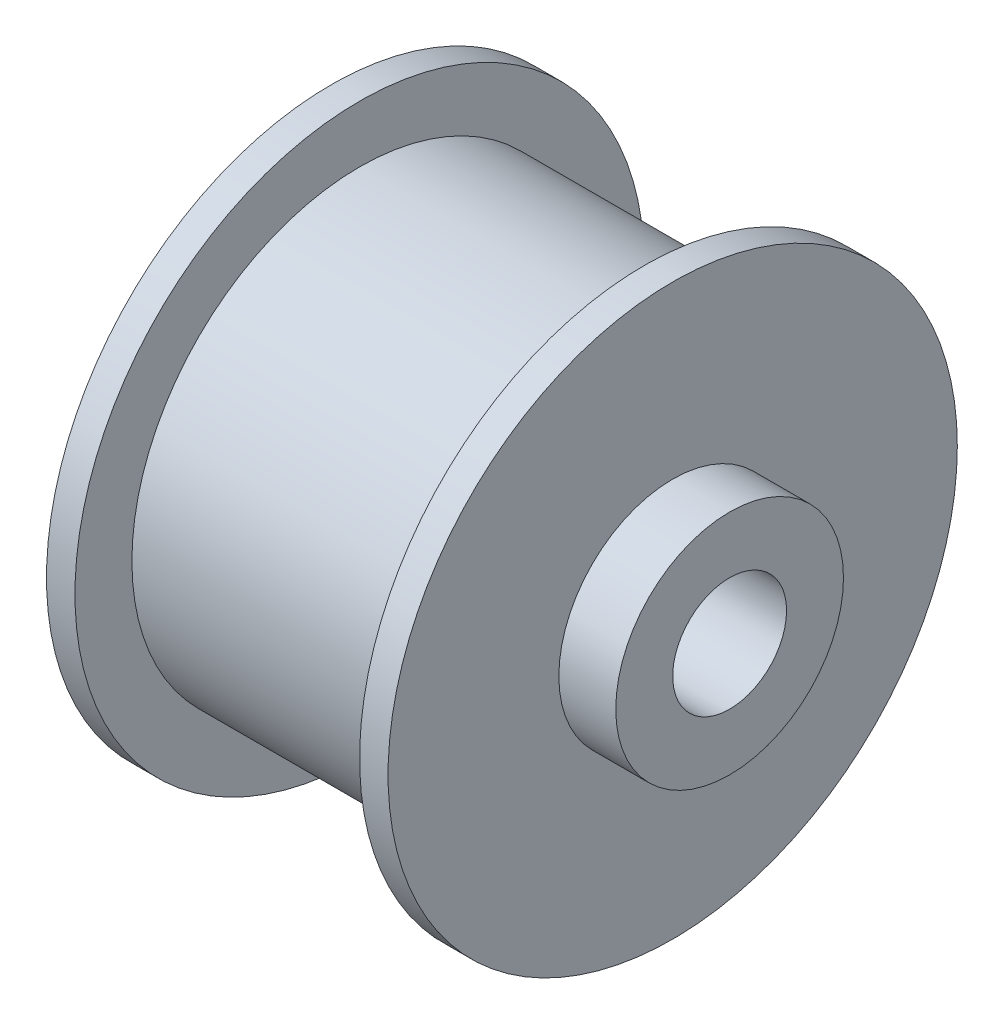
ISO-10303-21;
HEADER;
FILE_DESCRIPTION(('STEP AP214'),'2;1');
FILE_NAME('part.step','',(''),(''),'','','');
FILE_SCHEMA(('AUTOMOTIVE_DESIGN { 1 0 10303 214 1 1 1 1 }'));
ENDSEC;
DATA;
#1=APPLICATION_CONTEXT('core data for automotive mechanical design processes');
#2=APPLICATION_PROTOCOL_DEFINITION('international standard','automotive_design',2000,#1);
#3=PRODUCT_CONTEXT('',#1,'mechanical');
#4=PRODUCT('Part','Part','',(#3));
#5=PRODUCT_RELATED_PRODUCT_CATEGORY('part','',(#4));
#6=PRODUCT_DEFINITION_FORMATION('','',#4);
#7=PRODUCT_DEFINITION_CONTEXT('part definition',#1,'design');
#8=PRODUCT_DEFINITION('design','',#6,#7);
#9=PRODUCT_DEFINITION_SHAPE('','',#8);
#10=(LENGTH_UNIT() NAMED_UNIT(*) SI_UNIT(.MILLI.,.METRE.));
#11=(NAMED_UNIT(*) PLANE_ANGLE_UNIT() SI_UNIT($,.RADIAN.));
#12=(NAMED_UNIT(*) SI_UNIT($,.STERADIAN.) SOLID_ANGLE_UNIT());
#13=UNCERTAINTY_MEASURE_WITH_UNIT(LENGTH_MEASURE(1.E-05),#10,'distance_accuracy_value','');
#14=(GEOMETRIC_REPRESENTATION_CONTEXT(3) GLOBAL_UNCERTAINTY_ASSIGNED_CONTEXT((#13)) GLOBAL_UNIT_ASSIGNED_CONTEXT((#10,
#11,#12)) REPRESENTATION_CONTEXT('',''));
#15=CARTESIAN_POINT('',(0.,0.,0.));
#16=DIRECTION('',(0.,0.,1.));
#17=DIRECTION('',(1.,0.,0.));
#18=AXIS2_PLACEMENT_3D('',#15,#16,#17);
#19=CARTESIAN_POINT('',(0.,0.,0.));
#20=DIRECTION('',(1.,0.,0.));
#21=DIRECTION('',(0.,0.,-1.));
#22=AXIS2_PLACEMENT_3D('',#19,#20,#21);
#23=CYLINDRICAL_SURFACE('',#22,25.);
#24=CARTESIAN_POINT('',(-2.5,0.,0.));
#25=DIRECTION('',(1.,0.,0.));
#26=DIRECTION('',(0.,0.,-1.));
#27=AXIS2_PLACEMENT_3D('',#24,#25,#26);
#28=CIRCLE('',#27,25.);
#29=CARTESIAN_POINT('',(-2.5,0.,-25.));
#30=VERTEX_POINT('',#29);
#31=EDGE_CURVE('E50',#30,#30,#28,.T.);
#32=ORIENTED_EDGE('',*,*,#31,.T.);
#33=EDGE_LOOP('',(#32));
#34=FACE_BOUND('',#33,.T.);
#35=CARTESIAN_POINT('',(0.,0.,0.));
#36=DIRECTION('',(1.,0.,0.));
#37=DIRECTION('',(0.,0.,-1.));
#38=AXIS2_PLACEMENT_3D('',#35,#36,#37);
#39=CIRCLE('',#38,25.);
#40=CARTESIAN_POINT('',(0.,0.,-25.));
#41=VERTEX_POINT('',#40);
#42=EDGE_CURVE('E101',#41,#41,#39,.T.);
#43=ORIENTED_EDGE('',*,*,#42,.F.);
#44=EDGE_LOOP('',(#43));
#45=FACE_BOUND('',#44,.T.);
#46=ADVANCED_FACE('F37',(#34,#45),#23,.T.);
#47=CARTESIAN_POINT('',(-2.5,25.,0.));
#48=DIRECTION('',(-1.,0.,0.));
#49=DIRECTION('',(0.,0.,1.));
#50=AXIS2_PLACEMENT_3D('',#47,#48,#49);
#51=PLANE('',#50);
#52=CARTESIAN_POINT('',(-2.5,0.,0.));
#53=DIRECTION('',(1.,0.,0.));
#54=DIRECTION('',(0.,0.,-1.));
#55=AXIS2_PLACEMENT_3D('',#52,#53,#54);
#56=CIRCLE('',#55,20.);
#57=CARTESIAN_POINT('',(-2.5,0.,-20.));
#58=VERTEX_POINT('',#57);
#59=EDGE_CURVE('E55',#58,#58,#56,.T.);
#60=ORIENTED_EDGE('',*,*,#59,.T.);
#61=EDGE_LOOP('',(#60));
#62=FACE_BOUND('',#61,.T.);
#63=ORIENTED_EDGE('',*,*,#31,.F.);
#64=EDGE_LOOP('',(#63));
#65=FACE_BOUND('',#64,.T.);
#66=ADVANCED_FACE('F110',(#62,#65),#51,.T.);
#67=CARTESIAN_POINT('',(0.,0.,0.));
#68=DIRECTION('',(1.,0.,0.));
#69=DIRECTION('',(0.,0.,-1.));
#70=AXIS2_PLACEMENT_3D('',#67,#68,#69);
#71=CYLINDRICAL_SURFACE('',#70,20.);
#72=CARTESIAN_POINT('',(-27.5,0.,0.));
#73=DIRECTION('',(1.,0.,0.));
#74=DIRECTION('',(0.,0.,-1.));
#75=AXIS2_PLACEMENT_3D('',#72,#73,#74);
#76=CIRCLE('',#75,20.);
#77=CARTESIAN_POINT('',(-27.5,0.,-20.));
#78=VERTEX_POINT('',#77);
#79=EDGE_CURVE('E61',#78,#78,#76,.T.);
#80=ORIENTED_EDGE('',*,*,#79,.T.);
#81=EDGE_LOOP('',(#80));
#82=FACE_BOUND('',#81,.T.);
#83=ORIENTED_EDGE('',*,*,#59,.F.);
#84=EDGE_LOOP('',(#83));
#85=FACE_BOUND('',#84,.T.);
#86=ADVANCED_FACE('F115',(#82,#85),#71,.T.);
#87=CARTESIAN_POINT('',(-27.5,20.,0.));
#88=DIRECTION('',(1.,0.,0.));
#89=DIRECTION('',(0.,0.,-1.));
#90=AXIS2_PLACEMENT_3D('',#87,#88,#89);
#91=PLANE('',#90);
#92=CARTESIAN_POINT('',(-27.5,0.,0.));
#93=DIRECTION('',(1.,0.,0.));
#94=DIRECTION('',(0.,0.,-1.));
#95=AXIS2_PLACEMENT_3D('',#92,#93,#94);
#96=CIRCLE('',#95,25.);
#97=CARTESIAN_POINT('',(-27.5,0.,-25.));
#98=VERTEX_POINT('',#97);
#99=EDGE_CURVE('E65',#98,#98,#96,.T.);
#100=ORIENTED_EDGE('',*,*,#99,.T.);
#101=EDGE_LOOP('',(#100));
#102=FACE_BOUND('',#101,.T.);
#103=ORIENTED_EDGE('',*,*,#79,.F.);
#104=EDGE_LOOP('',(#103));
#105=FACE_BOUND('',#104,.T.);
#106=ADVANCED_FACE('F121',(#102,#105),#91,.T.);
#107=CARTESIAN_POINT('',(0.,0.,0.));
#108=DIRECTION('',(1.,0.,0.));
#109=DIRECTION('',(0.,0.,-1.));
#110=AXIS2_PLACEMENT_3D('',#107,#108,#109);
#111=CYLINDRICAL_SURFACE('',#110,25.);
#112=CARTESIAN_POINT('',(-30.,0.,0.));
#113=DIRECTION('',(1.,0.,0.));
#114=DIRECTION('',(0.,0.,-1.));
#115=AXIS2_PLACEMENT_3D('',#112,#113,#114);
#116=CIRCLE('',#115,25.);
#117=CARTESIAN_POINT('',(-30.,0.,-25.));
#118=VERTEX_POINT('',#117);
#119=EDGE_CURVE('E69',#118,#118,#116,.T.);
#120=ORIENTED_EDGE('',*,*,#119,.T.);
#121=EDGE_LOOP('',(#120));
#122=FACE_BOUND('',#121,.T.);
#123=ORIENTED_EDGE('',*,*,#99,.F.);
#124=EDGE_LOOP('',(#123));
#125=FACE_BOUND('',#124,.T.);
#126=ADVANCED_FACE('F125',(#122,#125),#111,.T.);
#127=CARTESIAN_POINT('',(-30.,25.,0.));
#128=DIRECTION('',(-1.,0.,0.));
#129=DIRECTION('',(0.,0.,1.));
#130=AXIS2_PLACEMENT_3D('',#127,#128,#129);
#131=PLANE('',#130);
#132=CARTESIAN_POINT('',(-30.,0.,0.));
#133=DIRECTION('',(1.,0.,0.));
#134=DIRECTION('',(0.,0.,-1.));
#135=AXIS2_PLACEMENT_3D('',#132,#133,#134);
#136=CIRCLE('',#135,17.5);
#137=CARTESIAN_POINT('',(-30.,0.,-17.5));
#138=VERTEX_POINT('',#137);
#139=EDGE_CURVE('E73',#138,#138,#136,.T.);
#140=ORIENTED_EDGE('',*,*,#139,.T.);
#141=EDGE_LOOP('',(#140));
#142=FACE_BOUND('',#141,.T.);
#143=ORIENTED_EDGE('',*,*,#119,.F.);
#144=EDGE_LOOP('',(#143));
#145=FACE_BOUND('',#144,.T.);
#146=ADVANCED_FACE('F129',(#142,#145),#131,.T.);
#147=CARTESIAN_POINT('',(0.,0.,0.));
#148=DIRECTION('',(1.,0.,0.));
#149=DIRECTION('',(0.,0.,-1.));
#150=AXIS2_PLACEMENT_3D('',#147,#148,#149);
#151=CYLINDRICAL_SURFACE('',#150,17.5);
#152=CARTESIAN_POINT('',(-25.,0.,0.));
#153=DIRECTION('',(1.,0.,0.));
#154=DIRECTION('',(0.,0.,-1.));
#155=AXIS2_PLACEMENT_3D('',#152,#153,#154);
#156=CIRCLE('',#155,17.5);
#157=CARTESIAN_POINT('',(-25.,0.,-17.5));
#158=VERTEX_POINT('',#157);
#159=EDGE_CURVE('E77',#158,#158,#156,.T.);
#160=ORIENTED_EDGE('',*,*,#159,.T.);
#161=EDGE_LOOP('',(#160));
#162=FACE_BOUND('',#161,.T.);
#163=ORIENTED_EDGE('',*,*,#139,.F.);
#164=EDGE_LOOP('',(#163));
#165=FACE_BOUND('',#164,.T.);
#166=ADVANCED_FACE('F133',(#162,#165),#151,.F.);
#167=CARTESIAN_POINT('',(-25.,7.5,0.));
#168=DIRECTION('',(-1.,0.,0.));
#169=DIRECTION('',(0.,0.,1.));
#170=AXIS2_PLACEMENT_3D('',#167,#168,#169);
#171=PLANE('',#170);
#172=CARTESIAN_POINT('',(-25.,0.,0.));
#173=DIRECTION('',(1.,0.,0.));
#174=DIRECTION('',(0.,0.,-1.));
#175=AXIS2_PLACEMENT_3D('',#172,#173,#174);
#176=CIRCLE('',#175,7.5);
#177=CARTESIAN_POINT('',(-25.,0.,-7.5));
#178=VERTEX_POINT('',#177);
#179=EDGE_CURVE('E81',#178,#178,#176,.T.);
#180=ORIENTED_EDGE('',*,*,#179,.T.);
#181=EDGE_LOOP('',(#180));
#182=FACE_BOUND('',#181,.T.);
#183=ORIENTED_EDGE('',*,*,#159,.F.);
#184=EDGE_LOOP('',(#183));
#185=FACE_BOUND('',#184,.T.);
#186=ADVANCED_FACE('F137',(#182,#185),#171,.T.);
#187=CARTESIAN_POINT('',(0.,0.,0.));
#188=DIRECTION('',(1.,0.,0.));
#189=DIRECTION('',(0.,0.,-1.));
#190=AXIS2_PLACEMENT_3D('',#187,#188,#189);
#191=CYLINDRICAL_SURFACE('',#190,7.5);
#192=CARTESIAN_POINT('',(-29.,0.,0.));
#193=DIRECTION('',(-1.,0.,0.));
#194=DIRECTION('',(0.,0.,1.));
#195=AXIS2_PLACEMENT_3D('',#192,#193,#194);
#196=CIRCLE('',#195,7.5);
#197=CARTESIAN_POINT('',(-29.,0.,7.5));
#198=VERTEX_POINT('',#197);
#199=EDGE_CURVE('E45',#198,#198,#196,.F.);
#200=ORIENTED_EDGE('',*,*,#199,.T.);
#201=EDGE_LOOP('',(#200));
#202=FACE_BOUND('',#201,.T.);
#203=ORIENTED_EDGE('',*,*,#179,.F.);
#204=EDGE_LOOP('',(#203));
#205=FACE_BOUND('',#204,.T.);
#206=ADVANCED_FACE('F141',(#202,#205),#191,.T.);
#207=CARTESIAN_POINT('',(-30.,7.5,0.));
#208=DIRECTION('',(-1.,0.,0.));
#209=DIRECTION('',(0.,0.,1.));
#210=AXIS2_PLACEMENT_3D('',#207,#208,#209);
#211=PLANE('',#210);
#212=CARTESIAN_POINT('',(-30.,0.,0.));
#213=DIRECTION('',(-1.,0.,0.));
#214=DIRECTION('',(0.,0.,1.));
#215=AXIS2_PLACEMENT_3D('',#212,#213,#214);
#216=CIRCLE('',#215,6.5);
#217=CARTESIAN_POINT('',(-30.,0.,6.5));
#218=VERTEX_POINT('',#217);
#219=EDGE_CURVE('E10',#218,#218,#216,.T.);
#220=ORIENTED_EDGE('',*,*,#219,.T.);
#221=EDGE_LOOP('',(#220));
#222=FACE_BOUND('',#221,.T.);
#223=CARTESIAN_POINT('',(-30.,0.,0.));
#224=DIRECTION('',(1.,0.,0.));
#225=DIRECTION('',(0.,0.,-1.));
#226=AXIS2_PLACEMENT_3D('',#223,#224,#225);
#227=CIRCLE('',#226,5.);
#228=CARTESIAN_POINT('',(-30.,0.,-5.));
#229=VERTEX_POINT('',#228);
#230=EDGE_CURVE('E85',#229,#229,#227,.T.);
#231=ORIENTED_EDGE('',*,*,#230,.T.);
#232=EDGE_LOOP('',(#231));
#233=FACE_BOUND('',#232,.T.);
#234=ADVANCED_FACE('F145',(#222,#233),#211,.T.);
#235=CARTESIAN_POINT('',(0.,0.,0.));
#236=DIRECTION('',(1.,0.,0.));
#237=DIRECTION('',(0.,0.,-1.));
#238=AXIS2_PLACEMENT_3D('',#235,#236,#237);
#239=CYLINDRICAL_SURFACE('',#238,5.);
#240=CARTESIAN_POINT('',(5.,0.,0.));
#241=DIRECTION('',(1.,0.,0.));
#242=DIRECTION('',(0.,0.,-1.));
#243=AXIS2_PLACEMENT_3D('',#240,#241,#242);
#244=CIRCLE('',#243,5.);
#245=CARTESIAN_POINT('',(5.,0.,-5.));
#246=VERTEX_POINT('',#245);
#247=EDGE_CURVE('E89',#246,#246,#244,.T.);
#248=ORIENTED_EDGE('',*,*,#247,.T.);
#249=EDGE_LOOP('',(#248));
#250=FACE_BOUND('',#249,.T.);
#251=ORIENTED_EDGE('',*,*,#230,.F.);
#252=EDGE_LOOP('',(#251));
#253=FACE_BOUND('',#252,.T.);
#254=ADVANCED_FACE('F148',(#250,#253),#239,.F.);
#255=CARTESIAN_POINT('',(5.00000000000001,5.,0.));
#256=DIRECTION('',(1.,0.,0.));
#257=DIRECTION('',(0.,0.,-1.));
#258=AXIS2_PLACEMENT_3D('',#255,#256,#257);
#259=PLANE('',#258);
#260=CARTESIAN_POINT('',(5.00000000000001,0.,0.));
#261=DIRECTION('',(1.,0.,0.));
#262=DIRECTION('',(0.,0.,-1.));
#263=AXIS2_PLACEMENT_3D('',#260,#261,#262);
#264=CIRCLE('',#263,10.);
#265=CARTESIAN_POINT('',(5.00000000000001,0.,-10.));
#266=VERTEX_POINT('',#265);
#267=EDGE_CURVE('E93',#266,#266,#264,.T.);
#268=ORIENTED_EDGE('',*,*,#267,.T.);
#269=EDGE_LOOP('',(#268));
#270=FACE_BOUND('',#269,.T.);
#271=ORIENTED_EDGE('',*,*,#247,.F.);
#272=EDGE_LOOP('',(#271));
#273=FACE_BOUND('',#272,.T.);
#274=ADVANCED_FACE('F151',(#270,#273),#259,.T.);
#275=CARTESIAN_POINT('',(0.,0.,0.));
#276=DIRECTION('',(1.,0.,0.));
#277=DIRECTION('',(0.,0.,-1.));
#278=AXIS2_PLACEMENT_3D('',#275,#276,#277);
#279=CYLINDRICAL_SURFACE('',#278,10.);
#280=CARTESIAN_POINT('',(0.,0.,0.));
#281=DIRECTION('',(1.,0.,0.));
#282=DIRECTION('',(0.,0.,-1.));
#283=AXIS2_PLACEMENT_3D('',#280,#281,#282);
#284=CIRCLE('',#283,10.);
#285=CARTESIAN_POINT('',(0.,0.,-10.));
#286=VERTEX_POINT('',#285);
#287=EDGE_CURVE('E97',#286,#286,#284,.T.);
#288=ORIENTED_EDGE('',*,*,#287,.T.);
#289=EDGE_LOOP('',(#288));
#290=FACE_BOUND('',#289,.T.);
#291=ORIENTED_EDGE('',*,*,#267,.F.);
#292=EDGE_LOOP('',(#291));
#293=FACE_BOUND('',#292,.T.);
#294=ADVANCED_FACE('F155',(#290,#293),#279,.T.);
#295=CARTESIAN_POINT('',(0.,10.,0.));
#296=DIRECTION('',(1.,0.,0.));
#297=DIRECTION('',(0.,0.,-1.));
#298=AXIS2_PLACEMENT_3D('',#295,#296,#297);
#299=PLANE('',#298);
#300=ORIENTED_EDGE('',*,*,#42,.T.);
#301=EDGE_LOOP('',(#300));
#302=FACE_BOUND('',#301,.T.);
#303=ORIENTED_EDGE('',*,*,#287,.F.);
#304=EDGE_LOOP('',(#303));
#305=FACE_BOUND('',#304,.T.);
#306=ADVANCED_FACE('F106',(#302,#305),#299,.T.);
#307=CARTESIAN_POINT('',(-29.,0.,0.));
#308=DIRECTION('',(-1.,0.,0.));
#309=DIRECTION('',(0.,0.,1.));
#310=AXIS2_PLACEMENT_3D('',#307,#308,#309);
#311=TOROIDAL_SURFACE('',#310,6.5,1.);
#312=ORIENTED_EDGE('',*,*,#219,.F.);
#313=EDGE_LOOP('',(#312));
#314=FACE_BOUND('',#313,.T.);
#315=ORIENTED_EDGE('',*,*,#199,.F.);
#316=EDGE_LOOP('',(#315));
#317=FACE_BOUND('',#316,.T.);
#318=ADVANCED_FACE('F39',(#314,#317),#311,.T.);
#319=CLOSED_SHELL('',(#46,#66,#86,#106,#126,#146,#166,#186,#206,#234,#254,#274,#294,#306,#318));
#320=MANIFOLD_SOLID_BREP('B2',#319);
#321=ADVANCED_BREP_SHAPE_REPRESENTATION('',(#18,#320),#14);
#322=SHAPE_DEFINITION_REPRESENTATION(#9,#321);
ENDSEC;
END-ISO-10303-21;
